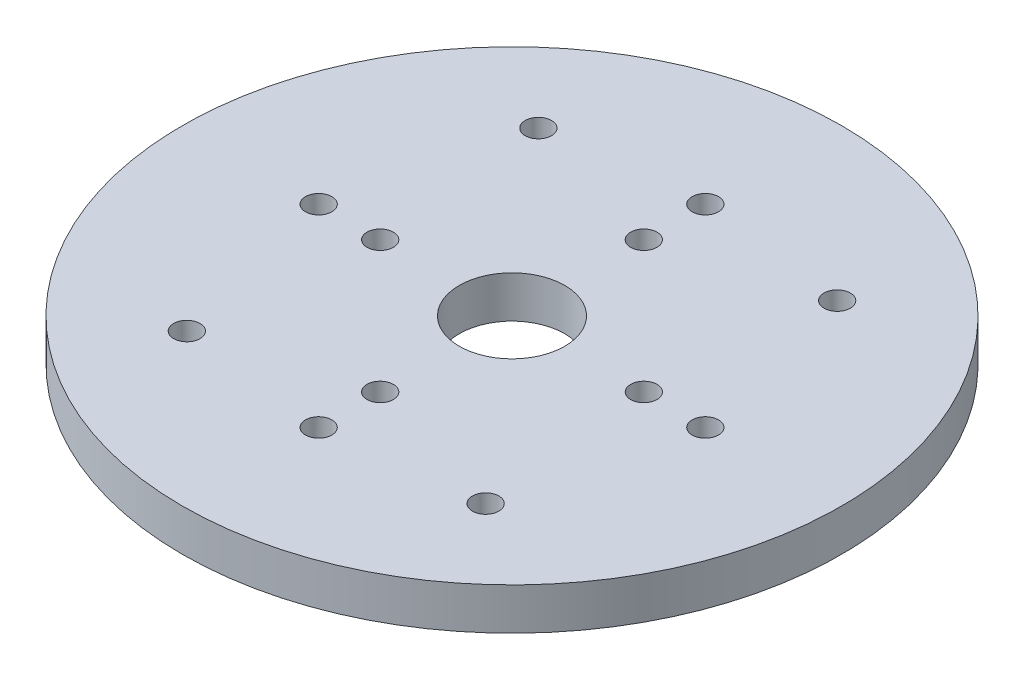
ISO-10303-21;
HEADER;
FILE_DESCRIPTION(('STEP AP214'),'2;1');
FILE_NAME('part.step','',(''),(''),'','','');
FILE_SCHEMA(('AUTOMOTIVE_DESIGN { 1 0 10303 214 1 1 1 1 }'));
ENDSEC;
DATA;
#1=APPLICATION_CONTEXT('core data for automotive mechanical design processes');
#2=APPLICATION_PROTOCOL_DEFINITION('international standard','automotive_design',2000,#1);
#3=PRODUCT_CONTEXT('',#1,'mechanical');
#4=PRODUCT('Part','Part','',(#3));
#5=PRODUCT_RELATED_PRODUCT_CATEGORY('part','',(#4));
#6=PRODUCT_DEFINITION_FORMATION('','',#4);
#7=PRODUCT_DEFINITION_CONTEXT('part definition',#1,'design');
#8=PRODUCT_DEFINITION('design','',#6,#7);
#9=PRODUCT_DEFINITION_SHAPE('','',#8);
#10=(LENGTH_UNIT() NAMED_UNIT(*) SI_UNIT(.MILLI.,.METRE.));
#11=(NAMED_UNIT(*) PLANE_ANGLE_UNIT() SI_UNIT($,.RADIAN.));
#12=(NAMED_UNIT(*) SI_UNIT($,.STERADIAN.) SOLID_ANGLE_UNIT());
#13=UNCERTAINTY_MEASURE_WITH_UNIT(LENGTH_MEASURE(1.E-05),#10,'distance_accuracy_value','');
#14=(GEOMETRIC_REPRESENTATION_CONTEXT(3) GLOBAL_UNCERTAINTY_ASSIGNED_CONTEXT((#13)) GLOBAL_UNIT_ASSIGNED_CONTEXT((#10,
#11,#12)) REPRESENTATION_CONTEXT('',''));
#15=CARTESIAN_POINT('',(0.,0.,0.));
#16=DIRECTION('',(0.,0.,1.));
#17=DIRECTION('',(1.,0.,0.));
#18=AXIS2_PLACEMENT_3D('',#15,#16,#17);
#19=CARTESIAN_POINT('',(0.,4.7625,0.));
#20=DIRECTION('',(0.,1.,0.));
#21=DIRECTION('',(0.,0.,1.));
#22=AXIS2_PLACEMENT_3D('',#19,#20,#21);
#23=PLANE('',#22);
#24=CARTESIAN_POINT('',(-17.,4.7625,-20.));
#25=DIRECTION('',(0.,1.,0.));
#26=DIRECTION('',(0.,0.,1.));
#27=AXIS2_PLACEMENT_3D('',#24,#25,#26);
#28=CIRCLE('',#27,1.49999999999999);
#29=CARTESIAN_POINT('',(-17.,4.7625,-18.5));
#30=VERTEX_POINT('',#29);
#31=EDGE_CURVE('E118',#30,#30,#28,.T.);
#32=ORIENTED_EDGE('',*,*,#31,.F.);
#33=EDGE_LOOP('',(#32));
#34=FACE_BOUND('',#33,.T.);
#35=CARTESIAN_POINT('',(17.,4.7625,20.));
#36=DIRECTION('',(0.,1.,0.));
#37=DIRECTION('',(0.,0.,1.));
#38=AXIS2_PLACEMENT_3D('',#35,#36,#37);
#39=CIRCLE('',#38,1.49999999999999);
#40=CARTESIAN_POINT('',(17.,4.7625,21.5));
#41=VERTEX_POINT('',#40);
#42=EDGE_CURVE('E112',#41,#41,#39,.T.);
#43=ORIENTED_EDGE('',*,*,#42,.F.);
#44=EDGE_LOOP('',(#43));
#45=FACE_BOUND('',#44,.T.);
#46=CARTESIAN_POINT('',(-17.,4.7625,20.));
#47=DIRECTION('',(0.,1.,0.));
#48=DIRECTION('',(0.,0.,1.));
#49=AXIS2_PLACEMENT_3D('',#46,#47,#48);
#50=CIRCLE('',#49,1.49999999999999);
#51=CARTESIAN_POINT('',(-17.,4.7625,21.5));
#52=VERTEX_POINT('',#51);
#53=EDGE_CURVE('E106',#52,#52,#50,.T.);
#54=ORIENTED_EDGE('',*,*,#53,.F.);
#55=EDGE_LOOP('',(#54));
#56=FACE_BOUND('',#55,.T.);
#57=CARTESIAN_POINT('',(17.,4.7625,-20.));
#58=DIRECTION('',(0.,1.,0.));
#59=DIRECTION('',(0.,0.,1.));
#60=AXIS2_PLACEMENT_3D('',#57,#58,#59);
#61=CIRCLE('',#60,1.49999999999999);
#62=CARTESIAN_POINT('',(17.,4.7625,-18.5));
#63=VERTEX_POINT('',#62);
#64=EDGE_CURVE('E100',#63,#63,#61,.T.);
#65=ORIENTED_EDGE('',*,*,#64,.F.);
#66=EDGE_LOOP('',(#65));
#67=FACE_BOUND('',#66,.T.);
#68=CARTESIAN_POINT('',(0.,4.7625,-15.));
#69=DIRECTION('',(0.,-1.,0.));
#70=DIRECTION('',(0.,0.,-1.));
#71=AXIS2_PLACEMENT_3D('',#68,#69,#70);
#72=CIRCLE('',#71,1.5);
#73=CARTESIAN_POINT('',(0.,4.7625,-16.5));
#74=VERTEX_POINT('',#73);
#75=EDGE_CURVE('E91',#74,#74,#72,.T.);
#76=ORIENTED_EDGE('',*,*,#75,.T.);
#77=EDGE_LOOP('',(#76));
#78=FACE_BOUND('',#77,.T.);
#79=CARTESIAN_POINT('',(0.,4.7625,-22.));
#80=DIRECTION('',(0.,-1.,0.));
#81=DIRECTION('',(0.,0.,-1.));
#82=AXIS2_PLACEMENT_3D('',#79,#80,#81);
#83=CIRCLE('',#82,1.5);
#84=CARTESIAN_POINT('',(0.,4.7625,-23.5));
#85=VERTEX_POINT('',#84);
#86=EDGE_CURVE('E85',#85,#85,#83,.T.);
#87=ORIENTED_EDGE('',*,*,#86,.T.);
#88=EDGE_LOOP('',(#87));
#89=FACE_BOUND('',#88,.T.);
#90=CARTESIAN_POINT('',(-22.,4.7625,0.));
#91=DIRECTION('',(0.,-1.,0.));
#92=DIRECTION('',(0.,0.,-1.));
#93=AXIS2_PLACEMENT_3D('',#90,#91,#92);
#94=CIRCLE('',#93,1.5);
#95=CARTESIAN_POINT('',(-22.,4.7625,-1.5));
#96=VERTEX_POINT('',#95);
#97=EDGE_CURVE('E79',#96,#96,#94,.T.);
#98=ORIENTED_EDGE('',*,*,#97,.T.);
#99=EDGE_LOOP('',(#98));
#100=FACE_BOUND('',#99,.T.);
#101=CARTESIAN_POINT('',(-15.,4.7625,0.));
#102=DIRECTION('',(0.,-1.,0.));
#103=DIRECTION('',(0.,0.,-1.));
#104=AXIS2_PLACEMENT_3D('',#101,#102,#103);
#105=CIRCLE('',#104,1.5);
#106=CARTESIAN_POINT('',(-15.,4.7625,-1.5));
#107=VERTEX_POINT('',#106);
#108=EDGE_CURVE('E73',#107,#107,#105,.T.);
#109=ORIENTED_EDGE('',*,*,#108,.T.);
#110=EDGE_LOOP('',(#109));
#111=FACE_BOUND('',#110,.T.);
#112=CARTESIAN_POINT('',(0.,4.7625,15.));
#113=DIRECTION('',(0.,-1.,0.));
#114=DIRECTION('',(0.,0.,-1.));
#115=AXIS2_PLACEMENT_3D('',#112,#113,#114);
#116=CIRCLE('',#115,1.5);
#117=CARTESIAN_POINT('',(0.,4.7625,13.5));
#118=VERTEX_POINT('',#117);
#119=EDGE_CURVE('E67',#118,#118,#116,.T.);
#120=ORIENTED_EDGE('',*,*,#119,.T.);
#121=EDGE_LOOP('',(#120));
#122=FACE_BOUND('',#121,.T.);
#123=CARTESIAN_POINT('',(0.,4.7625,22.));
#124=DIRECTION('',(0.,-1.,0.));
#125=DIRECTION('',(0.,0.,-1.));
#126=AXIS2_PLACEMENT_3D('',#123,#124,#125);
#127=CIRCLE('',#126,1.5);
#128=CARTESIAN_POINT('',(0.,4.7625,20.5));
#129=VERTEX_POINT('',#128);
#130=EDGE_CURVE('E61',#129,#129,#127,.T.);
#131=ORIENTED_EDGE('',*,*,#130,.T.);
#132=EDGE_LOOP('',(#131));
#133=FACE_BOUND('',#132,.T.);
#134=CARTESIAN_POINT('',(15.,4.7625,0.));
#135=DIRECTION('',(0.,-1.,0.));
#136=DIRECTION('',(0.,0.,-1.));
#137=AXIS2_PLACEMENT_3D('',#134,#135,#136);
#138=CIRCLE('',#137,1.5);
#139=CARTESIAN_POINT('',(15.,4.7625,-1.5));
#140=VERTEX_POINT('',#139);
#141=EDGE_CURVE('E55',#140,#140,#138,.T.);
#142=ORIENTED_EDGE('',*,*,#141,.T.);
#143=EDGE_LOOP('',(#142));
#144=FACE_BOUND('',#143,.T.);
#145=CARTESIAN_POINT('',(22.,4.7625,0.));
#146=DIRECTION('',(0.,-1.,0.));
#147=DIRECTION('',(0.,0.,-1.));
#148=AXIS2_PLACEMENT_3D('',#145,#146,#147);
#149=CIRCLE('',#148,1.5);
#150=CARTESIAN_POINT('',(22.,4.7625,-1.5));
#151=VERTEX_POINT('',#150);
#152=EDGE_CURVE('E47',#151,#151,#149,.T.);
#153=ORIENTED_EDGE('',*,*,#152,.T.);
#154=EDGE_LOOP('',(#153));
#155=FACE_BOUND('',#154,.T.);
#156=CARTESIAN_POINT('',(0.,4.7625,0.));
#157=DIRECTION('',(0.,1.,0.));
#158=DIRECTION('',(0.,0.,1.));
#159=AXIS2_PLACEMENT_3D('',#156,#157,#158);
#160=CIRCLE('',#159,37.5);
#161=CARTESIAN_POINT('',(0.,4.7625,-37.5));
#162=VERTEX_POINT('',#161);
#163=EDGE_CURVE('E10',#162,#162,#160,.T.);
#164=ORIENTED_EDGE('',*,*,#163,.T.);
#165=EDGE_LOOP('',(#164));
#166=FACE_BOUND('',#165,.T.);
#167=CARTESIAN_POINT('',(0.,4.7625,0.));
#168=DIRECTION('',(0.,1.,0.));
#169=DIRECTION('',(0.,0.,1.));
#170=AXIS2_PLACEMENT_3D('',#167,#168,#169);
#171=CIRCLE('',#170,6.);
#172=CARTESIAN_POINT('',(0.,4.7625,-6.));
#173=VERTEX_POINT('',#172);
#174=EDGE_CURVE('E42',#173,#173,#171,.T.);
#175=ORIENTED_EDGE('',*,*,#174,.F.);
#176=EDGE_LOOP('',(#175));
#177=FACE_BOUND('',#176,.T.);
#178=ADVANCED_FACE('F31',(#34,#45,#56,#67,#78,#89,#100,#111,#122,#133,#144,#155,#166,#177),#23,.T.);
#179=CARTESIAN_POINT('',(0.,0.,0.));
#180=DIRECTION('',(0.,1.,0.));
#181=DIRECTION('',(0.,0.,1.));
#182=AXIS2_PLACEMENT_3D('',#179,#180,#181);
#183=PLANE('',#182);
#184=CARTESIAN_POINT('',(-17.,0.,-20.));
#185=DIRECTION('',(0.,1.,0.));
#186=DIRECTION('',(0.,0.,1.));
#187=AXIS2_PLACEMENT_3D('',#184,#185,#186);
#188=CIRCLE('',#187,1.49999999999999);
#189=CARTESIAN_POINT('',(-17.,0.,-18.5));
#190=VERTEX_POINT('',#189);
#191=EDGE_CURVE('E115',#190,#190,#188,.T.);
#192=ORIENTED_EDGE('',*,*,#191,.T.);
#193=EDGE_LOOP('',(#192));
#194=FACE_BOUND('',#193,.T.);
#195=CARTESIAN_POINT('',(17.,0.,20.));
#196=DIRECTION('',(0.,1.,0.));
#197=DIRECTION('',(0.,0.,1.));
#198=AXIS2_PLACEMENT_3D('',#195,#196,#197);
#199=CIRCLE('',#198,1.49999999999999);
#200=CARTESIAN_POINT('',(17.,0.,21.5));
#201=VERTEX_POINT('',#200);
#202=EDGE_CURVE('E109',#201,#201,#199,.T.);
#203=ORIENTED_EDGE('',*,*,#202,.T.);
#204=EDGE_LOOP('',(#203));
#205=FACE_BOUND('',#204,.T.);
#206=CARTESIAN_POINT('',(-17.,0.,20.));
#207=DIRECTION('',(0.,1.,0.));
#208=DIRECTION('',(0.,0.,1.));
#209=AXIS2_PLACEMENT_3D('',#206,#207,#208);
#210=CIRCLE('',#209,1.49999999999999);
#211=CARTESIAN_POINT('',(-17.,0.,21.5));
#212=VERTEX_POINT('',#211);
#213=EDGE_CURVE('E103',#212,#212,#210,.T.);
#214=ORIENTED_EDGE('',*,*,#213,.T.);
#215=EDGE_LOOP('',(#214));
#216=FACE_BOUND('',#215,.T.);
#217=CARTESIAN_POINT('',(17.,0.,-20.));
#218=DIRECTION('',(0.,1.,0.));
#219=DIRECTION('',(0.,0.,1.));
#220=AXIS2_PLACEMENT_3D('',#217,#218,#219);
#221=CIRCLE('',#220,1.49999999999999);
#222=CARTESIAN_POINT('',(17.,0.,-18.5));
#223=VERTEX_POINT('',#222);
#224=EDGE_CURVE('E97',#223,#223,#221,.T.);
#225=ORIENTED_EDGE('',*,*,#224,.T.);
#226=EDGE_LOOP('',(#225));
#227=FACE_BOUND('',#226,.T.);
#228=CARTESIAN_POINT('',(0.,0.,-15.));
#229=DIRECTION('',(0.,-1.,0.));
#230=DIRECTION('',(0.,0.,-1.));
#231=AXIS2_PLACEMENT_3D('',#228,#229,#230);
#232=CIRCLE('',#231,1.5);
#233=CARTESIAN_POINT('',(0.,0.,-16.5));
#234=VERTEX_POINT('',#233);
#235=EDGE_CURVE('E94',#234,#234,#232,.T.);
#236=ORIENTED_EDGE('',*,*,#235,.F.);
#237=EDGE_LOOP('',(#236));
#238=FACE_BOUND('',#237,.T.);
#239=CARTESIAN_POINT('',(0.,0.,-22.));
#240=DIRECTION('',(0.,-1.,0.));
#241=DIRECTION('',(0.,0.,-1.));
#242=AXIS2_PLACEMENT_3D('',#239,#240,#241);
#243=CIRCLE('',#242,1.5);
#244=CARTESIAN_POINT('',(0.,0.,-23.5));
#245=VERTEX_POINT('',#244);
#246=EDGE_CURVE('E88',#245,#245,#243,.T.);
#247=ORIENTED_EDGE('',*,*,#246,.F.);
#248=EDGE_LOOP('',(#247));
#249=FACE_BOUND('',#248,.T.);
#250=CARTESIAN_POINT('',(-22.,0.,0.));
#251=DIRECTION('',(0.,-1.,0.));
#252=DIRECTION('',(0.,0.,-1.));
#253=AXIS2_PLACEMENT_3D('',#250,#251,#252);
#254=CIRCLE('',#253,1.5);
#255=CARTESIAN_POINT('',(-22.,0.,-1.5));
#256=VERTEX_POINT('',#255);
#257=EDGE_CURVE('E82',#256,#256,#254,.T.);
#258=ORIENTED_EDGE('',*,*,#257,.F.);
#259=EDGE_LOOP('',(#258));
#260=FACE_BOUND('',#259,.T.);
#261=CARTESIAN_POINT('',(-15.,0.,0.));
#262=DIRECTION('',(0.,-1.,0.));
#263=DIRECTION('',(0.,0.,-1.));
#264=AXIS2_PLACEMENT_3D('',#261,#262,#263);
#265=CIRCLE('',#264,1.5);
#266=CARTESIAN_POINT('',(-15.,0.,-1.5));
#267=VERTEX_POINT('',#266);
#268=EDGE_CURVE('E76',#267,#267,#265,.T.);
#269=ORIENTED_EDGE('',*,*,#268,.F.);
#270=EDGE_LOOP('',(#269));
#271=FACE_BOUND('',#270,.T.);
#272=CARTESIAN_POINT('',(0.,0.,15.));
#273=DIRECTION('',(0.,-1.,0.));
#274=DIRECTION('',(0.,0.,-1.));
#275=AXIS2_PLACEMENT_3D('',#272,#273,#274);
#276=CIRCLE('',#275,1.5);
#277=CARTESIAN_POINT('',(0.,0.,13.5));
#278=VERTEX_POINT('',#277);
#279=EDGE_CURVE('E70',#278,#278,#276,.T.);
#280=ORIENTED_EDGE('',*,*,#279,.F.);
#281=EDGE_LOOP('',(#280));
#282=FACE_BOUND('',#281,.T.);
#283=CARTESIAN_POINT('',(0.,0.,22.));
#284=DIRECTION('',(0.,-1.,0.));
#285=DIRECTION('',(0.,0.,-1.));
#286=AXIS2_PLACEMENT_3D('',#283,#284,#285);
#287=CIRCLE('',#286,1.5);
#288=CARTESIAN_POINT('',(0.,0.,20.5));
#289=VERTEX_POINT('',#288);
#290=EDGE_CURVE('E64',#289,#289,#287,.T.);
#291=ORIENTED_EDGE('',*,*,#290,.F.);
#292=EDGE_LOOP('',(#291));
#293=FACE_BOUND('',#292,.T.);
#294=CARTESIAN_POINT('',(15.,0.,0.));
#295=DIRECTION('',(0.,-1.,0.));
#296=DIRECTION('',(0.,0.,-1.));
#297=AXIS2_PLACEMENT_3D('',#294,#295,#296);
#298=CIRCLE('',#297,1.5);
#299=CARTESIAN_POINT('',(15.,0.,-1.5));
#300=VERTEX_POINT('',#299);
#301=EDGE_CURVE('E58',#300,#300,#298,.T.);
#302=ORIENTED_EDGE('',*,*,#301,.F.);
#303=EDGE_LOOP('',(#302));
#304=FACE_BOUND('',#303,.T.);
#305=CARTESIAN_POINT('',(22.,0.,0.));
#306=DIRECTION('',(0.,-1.,0.));
#307=DIRECTION('',(0.,0.,-1.));
#308=AXIS2_PLACEMENT_3D('',#305,#306,#307);
#309=CIRCLE('',#308,1.5);
#310=CARTESIAN_POINT('',(22.,0.,-1.5));
#311=VERTEX_POINT('',#310);
#312=EDGE_CURVE('E52',#311,#311,#309,.T.);
#313=ORIENTED_EDGE('',*,*,#312,.F.);
#314=EDGE_LOOP('',(#313));
#315=FACE_BOUND('',#314,.T.);
#316=CARTESIAN_POINT('',(0.,0.,0.));
#317=DIRECTION('',(0.,1.,0.));
#318=DIRECTION('',(0.,0.,1.));
#319=AXIS2_PLACEMENT_3D('',#316,#317,#318);
#320=CIRCLE('',#319,37.5);
#321=CARTESIAN_POINT('',(0.,0.,-37.5));
#322=VERTEX_POINT('',#321);
#323=EDGE_CURVE('E35',#322,#322,#320,.T.);
#324=ORIENTED_EDGE('',*,*,#323,.F.);
#325=EDGE_LOOP('',(#324));
#326=FACE_BOUND('',#325,.T.);
#327=CARTESIAN_POINT('',(0.,0.,0.));
#328=DIRECTION('',(0.,1.,0.));
#329=DIRECTION('',(0.,0.,1.));
#330=AXIS2_PLACEMENT_3D('',#327,#328,#329);
#331=CIRCLE('',#330,6.);
#332=CARTESIAN_POINT('',(0.,0.,-6.));
#333=VERTEX_POINT('',#332);
#334=EDGE_CURVE('E44',#333,#333,#331,.T.);
#335=ORIENTED_EDGE('',*,*,#334,.T.);
#336=EDGE_LOOP('',(#335));
#337=FACE_BOUND('',#336,.T.);
#338=ADVANCED_FACE('F127',(#194,#205,#216,#227,#238,#249,#260,#271,#282,#293,#304,#315,#326,
#337),#183,.F.);
#339=CARTESIAN_POINT('',(0.,4.7625,0.));
#340=DIRECTION('',(0.,-1.,0.));
#341=DIRECTION('',(0.,0.,-1.));
#342=AXIS2_PLACEMENT_3D('',#339,#340,#341);
#343=CYLINDRICAL_SURFACE('',#342,37.5);
#344=CARTESIAN_POINT('',(0.,4.7625,-37.5));
#345=CARTESIAN_POINT('',(0.,4.712890625,-37.5));
#346=CARTESIAN_POINT('',(0.,4.66328125,-37.5));
#347=CARTESIAN_POINT('',(0.,4.5640625,-37.5));
#348=CARTESIAN_POINT('',(0.,4.514453125,-37.5));
#349=CARTESIAN_POINT('',(0.,4.415234375,-37.5));
#350=CARTESIAN_POINT('',(0.,4.365625,-37.5));
#351=CARTESIAN_POINT('',(0.,4.26640625,-37.5));
#352=CARTESIAN_POINT('',(0.,4.216796875,-37.5));
#353=CARTESIAN_POINT('',(0.,4.117578125,-37.5));
#354=CARTESIAN_POINT('',(0.,4.06796875,-37.5));
#355=CARTESIAN_POINT('',(0.,3.96875,-37.5));
#356=CARTESIAN_POINT('',(0.,3.919140625,-37.5));
#357=CARTESIAN_POINT('',(0.,3.819921875,-37.5));
#358=CARTESIAN_POINT('',(0.,3.7703125,-37.5));
#359=CARTESIAN_POINT('',(0.,3.67109375,-37.5));
#360=CARTESIAN_POINT('',(0.,3.621484375,-37.5));
#361=CARTESIAN_POINT('',(0.,3.522265625,-37.5));
#362=CARTESIAN_POINT('',(0.,3.47265625,-37.5));
#363=CARTESIAN_POINT('',(0.,3.3734375,-37.5));
#364=CARTESIAN_POINT('',(0.,3.323828125,-37.5));
#365=CARTESIAN_POINT('',(0.,3.224609375,-37.5));
#366=CARTESIAN_POINT('',(0.,3.175,-37.5));
#367=CARTESIAN_POINT('',(0.,3.07578125,-37.5));
#368=CARTESIAN_POINT('',(0.,3.026171875,-37.5));
#369=CARTESIAN_POINT('',(0.,2.926953125,-37.5));
#370=CARTESIAN_POINT('',(0.,2.87734375,-37.5));
#371=CARTESIAN_POINT('',(0.,2.778125,-37.5));
#372=CARTESIAN_POINT('',(0.,2.728515625,-37.5));
#373=CARTESIAN_POINT('',(0.,2.629296875,-37.5));
#374=CARTESIAN_POINT('',(0.,2.5796875,-37.5));
#375=CARTESIAN_POINT('',(0.,2.48046875,-37.5));
#376=CARTESIAN_POINT('',(0.,2.430859375,-37.5));
#377=CARTESIAN_POINT('',(0.,2.331640625,-37.5));
#378=CARTESIAN_POINT('',(0.,2.28203125,-37.5));
#379=CARTESIAN_POINT('',(0.,2.1828125,-37.5));
#380=CARTESIAN_POINT('',(0.,2.133203125,-37.5));
#381=CARTESIAN_POINT('',(0.,2.033984375,-37.5));
#382=CARTESIAN_POINT('',(0.,1.984375,-37.5));
#383=CARTESIAN_POINT('',(0.,1.88515625,-37.5));
#384=CARTESIAN_POINT('',(0.,1.835546875,-37.5));
#385=CARTESIAN_POINT('',(0.,1.736328125,-37.5));
#386=CARTESIAN_POINT('',(0.,1.68671875,-37.5));
#387=CARTESIAN_POINT('',(0.,1.5875,-37.5));
#388=CARTESIAN_POINT('',(0.,1.537890625,-37.5));
#389=CARTESIAN_POINT('',(0.,1.438671875,-37.5));
#390=CARTESIAN_POINT('',(0.,1.3890625,-37.5));
#391=CARTESIAN_POINT('',(0.,1.28984375,-37.5));
#392=CARTESIAN_POINT('',(0.,1.240234375,-37.5));
#393=CARTESIAN_POINT('',(0.,1.141015625,-37.5));
#394=CARTESIAN_POINT('',(0.,1.09140625,-37.5));
#395=CARTESIAN_POINT('',(0.,0.9921875,-37.5));
#396=CARTESIAN_POINT('',(0.,0.942578125,-37.5));
#397=CARTESIAN_POINT('',(0.,0.843359375,-37.5));
#398=CARTESIAN_POINT('',(0.,0.79375,-37.5));
#399=CARTESIAN_POINT('',(0.,0.69453125,-37.5));
#400=CARTESIAN_POINT('',(0.,0.644921875,-37.5));
#401=CARTESIAN_POINT('',(0.,0.545703125,-37.5));
#402=CARTESIAN_POINT('',(0.,0.49609375,-37.5));
#403=CARTESIAN_POINT('',(0.,0.396875,-37.5));
#404=CARTESIAN_POINT('',(0.,0.347265625,-37.5));
#405=CARTESIAN_POINT('',(0.,0.248046875,-37.5));
#406=CARTESIAN_POINT('',(0.,0.1984375,-37.5));
#407=CARTESIAN_POINT('',(0.,0.09921875,-37.5));
#408=CARTESIAN_POINT('',(0.,0.049609375,-37.5));
#409=CARTESIAN_POINT('',(0.,0.,-37.5));
#410=B_SPLINE_CURVE_WITH_KNOTS('',3,(#344,#345,#346,#347,#348,#349,#350,#351,#352,#353,#354,
#355,#356,#357,#358,#359,#360,#361,#362,#363,#364,#365,#366,#367,#368,#369,#370,#371,#372,#373,
#374,#375,#376,#377,#378,#379,#380,#381,#382,#383,#384,#385,#386,#387,#388,#389,#390,#391,#392,
#393,#394,#395,#396,#397,#398,#399,#400,#401,#402,#403,#404,#405,#406,#407,#408,#409),
.UNSPECIFIED.,.F.,.F.,(4,2,2,2,2,2,2,2,2,2,2,2,2,2,2,2,2,2,2,2,2,2,2,2,2,2,2,2,2,2,2,2,4),(0.,
0.148828124999999,0.297656249999999,0.446484374999999,0.595312499999999,0.744140625,0.89296875,
1.041796875,1.190625,1.339453125,1.48828125,1.637109375,1.7859375,1.934765625,2.08359375,
2.232421875,2.38125,2.530078125,2.67890625,2.827734375,2.9765625,3.125390625,3.27421875,
3.423046875,3.571875,3.720703125,3.86953125,4.018359375,4.1671875,4.316015625,4.46484375,
4.613671875,4.7625),.UNSPECIFIED.);
#411=EDGE_CURVE('BSEAM33',#162,#322,#410,.T.);
#412=ORIENTED_EDGE('',*,*,#163,.F.);
#413=ORIENTED_EDGE('',*,*,#323,.T.);
#414=ORIENTED_EDGE('',*,*,#411,.T.);
#415=ORIENTED_EDGE('',*,*,#411,.F.);
#416=EDGE_LOOP('',(#412,#414,#413,#415));
#417=FACE_BOUND('',#416,.T.);
#418=ADVANCED_FACE('F33',(#417),#343,.T.);
#419=CARTESIAN_POINT('',(0.,4.7625,0.));
#420=DIRECTION('',(0.,-1.,0.));
#421=DIRECTION('',(0.,0.,-1.));
#422=AXIS2_PLACEMENT_3D('',#419,#420,#421);
#423=CYLINDRICAL_SURFACE('',#422,6.);
#424=CARTESIAN_POINT('',(0.,4.7625,-6.));
#425=CARTESIAN_POINT('',(0.,4.712890625,-6.));
#426=CARTESIAN_POINT('',(0.,4.66328125,-6.));
#427=CARTESIAN_POINT('',(0.,4.5640625,-6.));
#428=CARTESIAN_POINT('',(0.,4.514453125,-6.));
#429=CARTESIAN_POINT('',(0.,4.415234375,-6.));
#430=CARTESIAN_POINT('',(0.,4.365625,-6.));
#431=CARTESIAN_POINT('',(0.,4.26640625,-6.));
#432=CARTESIAN_POINT('',(0.,4.216796875,-6.));
#433=CARTESIAN_POINT('',(0.,4.117578125,-6.));
#434=CARTESIAN_POINT('',(0.,4.06796875,-6.));
#435=CARTESIAN_POINT('',(0.,3.96875,-6.));
#436=CARTESIAN_POINT('',(0.,3.919140625,-6.));
#437=CARTESIAN_POINT('',(0.,3.819921875,-6.));
#438=CARTESIAN_POINT('',(0.,3.7703125,-6.));
#439=CARTESIAN_POINT('',(0.,3.67109375,-6.));
#440=CARTESIAN_POINT('',(0.,3.621484375,-6.));
#441=CARTESIAN_POINT('',(0.,3.522265625,-6.));
#442=CARTESIAN_POINT('',(0.,3.47265625,-6.));
#443=CARTESIAN_POINT('',(0.,3.3734375,-6.));
#444=CARTESIAN_POINT('',(0.,3.323828125,-6.));
#445=CARTESIAN_POINT('',(0.,3.224609375,-6.));
#446=CARTESIAN_POINT('',(0.,3.175,-6.));
#447=CARTESIAN_POINT('',(0.,3.07578125,-6.));
#448=CARTESIAN_POINT('',(0.,3.026171875,-6.));
#449=CARTESIAN_POINT('',(0.,2.926953125,-6.));
#450=CARTESIAN_POINT('',(0.,2.87734375,-6.));
#451=CARTESIAN_POINT('',(0.,2.778125,-6.));
#452=CARTESIAN_POINT('',(0.,2.728515625,-6.));
#453=CARTESIAN_POINT('',(0.,2.629296875,-6.));
#454=CARTESIAN_POINT('',(0.,2.5796875,-6.));
#455=CARTESIAN_POINT('',(0.,2.48046875,-6.));
#456=CARTESIAN_POINT('',(0.,2.430859375,-6.));
#457=CARTESIAN_POINT('',(0.,2.331640625,-6.));
#458=CARTESIAN_POINT('',(0.,2.28203125,-6.));
#459=CARTESIAN_POINT('',(0.,2.1828125,-6.));
#460=CARTESIAN_POINT('',(0.,2.133203125,-6.));
#461=CARTESIAN_POINT('',(0.,2.033984375,-6.));
#462=CARTESIAN_POINT('',(0.,1.984375,-6.));
#463=CARTESIAN_POINT('',(0.,1.88515625,-6.));
#464=CARTESIAN_POINT('',(0.,1.835546875,-6.));
#465=CARTESIAN_POINT('',(0.,1.736328125,-6.));
#466=CARTESIAN_POINT('',(0.,1.68671875,-6.));
#467=CARTESIAN_POINT('',(0.,1.5875,-6.));
#468=CARTESIAN_POINT('',(0.,1.537890625,-6.));
#469=CARTESIAN_POINT('',(0.,1.438671875,-6.));
#470=CARTESIAN_POINT('',(0.,1.3890625,-6.));
#471=CARTESIAN_POINT('',(0.,1.28984375,-6.));
#472=CARTESIAN_POINT('',(0.,1.240234375,-6.));
#473=CARTESIAN_POINT('',(0.,1.141015625,-6.));
#474=CARTESIAN_POINT('',(0.,1.09140625,-6.));
#475=CARTESIAN_POINT('',(0.,0.992187499999999,-6.));
#476=CARTESIAN_POINT('',(0.,0.942578124999999,-6.));
#477=CARTESIAN_POINT('',(0.,0.843359375,-6.));
#478=CARTESIAN_POINT('',(0.,0.79375,-6.));
#479=CARTESIAN_POINT('',(0.,0.69453125,-6.));
#480=CARTESIAN_POINT('',(0.,0.644921875,-6.));
#481=CARTESIAN_POINT('',(0.,0.545703125,-6.));
#482=CARTESIAN_POINT('',(0.,0.49609375,-6.));
#483=CARTESIAN_POINT('',(0.,0.396875,-6.));
#484=CARTESIAN_POINT('',(0.,0.347265625,-6.));
#485=CARTESIAN_POINT('',(0.,0.248046875,-6.));
#486=CARTESIAN_POINT('',(0.,0.1984375,-6.));
#487=CARTESIAN_POINT('',(0.,0.09921875,-6.));
#488=CARTESIAN_POINT('',(0.,0.049609375,-6.));
#489=CARTESIAN_POINT('',(0.,0.,-6.));
#490=B_SPLINE_CURVE_WITH_KNOTS('',3,(#424,#425,#426,#427,#428,#429,#430,#431,#432,#433,#434,
#435,#436,#437,#438,#439,#440,#441,#442,#443,#444,#445,#446,#447,#448,#449,#450,#451,#452,#453,
#454,#455,#456,#457,#458,#459,#460,#461,#462,#463,#464,#465,#466,#467,#468,#469,#470,#471,#472,
#473,#474,#475,#476,#477,#478,#479,#480,#481,#482,#483,#484,#485,#486,#487,#488,#489),
.UNSPECIFIED.,.F.,.F.,(4,2,2,2,2,2,2,2,2,2,2,2,2,2,2,2,2,2,2,2,2,2,2,2,2,2,2,2,2,2,2,2,4),(0.,
0.148828125,0.29765625,0.446484375,0.5953125,0.744140625,0.892968750000001,1.041796875,1.190625,
1.339453125,1.48828125,1.637109375,1.7859375,1.934765625,2.08359375,2.232421875,2.38125,
2.530078125,2.67890625,2.827734375,2.9765625,3.125390625,3.27421875,3.423046875,3.571875,
3.720703125,3.86953125,4.018359375,4.1671875,4.316015625,4.46484375,4.613671875,4.7625),.UNSPECIFIED.);
#491=EDGE_CURVE('BSEAM153',#173,#333,#490,.T.);
#492=ORIENTED_EDGE('',*,*,#174,.T.);
#493=ORIENTED_EDGE('',*,*,#334,.F.);
#494=ORIENTED_EDGE('',*,*,#491,.T.);
#495=ORIENTED_EDGE('',*,*,#491,.F.);
#496=EDGE_LOOP('',(#492,#494,#493,#495));
#497=FACE_BOUND('',#496,.T.);
#498=ADVANCED_FACE('F153',(#497),#423,.F.);
#499=CARTESIAN_POINT('',(22.,0.,0.));
#500=DIRECTION('',(0.,-1.,0.));
#501=DIRECTION('',(0.,0.,-1.));
#502=AXIS2_PLACEMENT_3D('',#499,#500,#501);
#503=CYLINDRICAL_SURFACE('',#502,1.5);
#504=ORIENTED_EDGE('',*,*,#152,.F.);
#505=EDGE_LOOP('',(#504));
#506=FACE_BOUND('',#505,.T.);
#507=ORIENTED_EDGE('',*,*,#312,.T.);
#508=EDGE_LOOP('',(#507));
#509=FACE_BOUND('',#508,.T.);
#510=ADVANCED_FACE('F156',(#506,#509),#503,.F.);
#511=CARTESIAN_POINT('',(15.,0.,0.));
#512=DIRECTION('',(0.,-1.,0.));
#513=DIRECTION('',(0.,0.,-1.));
#514=AXIS2_PLACEMENT_3D('',#511,#512,#513);
#515=CYLINDRICAL_SURFACE('',#514,1.5);
#516=ORIENTED_EDGE('',*,*,#141,.F.);
#517=EDGE_LOOP('',(#516));
#518=FACE_BOUND('',#517,.T.);
#519=ORIENTED_EDGE('',*,*,#301,.T.);
#520=EDGE_LOOP('',(#519));
#521=FACE_BOUND('',#520,.T.);
#522=ADVANCED_FACE('F170',(#518,#521),#515,.F.);
#523=CARTESIAN_POINT('',(0.,0.,22.));
#524=DIRECTION('',(0.,-1.,0.));
#525=DIRECTION('',(0.,0.,-1.));
#526=AXIS2_PLACEMENT_3D('',#523,#524,#525);
#527=CYLINDRICAL_SURFACE('',#526,1.5);
#528=ORIENTED_EDGE('',*,*,#130,.F.);
#529=EDGE_LOOP('',(#528));
#530=FACE_BOUND('',#529,.T.);
#531=ORIENTED_EDGE('',*,*,#290,.T.);
#532=EDGE_LOOP('',(#531));
#533=FACE_BOUND('',#532,.T.);
#534=ADVANCED_FACE('F174',(#530,#533),#527,.F.);
#535=CARTESIAN_POINT('',(0.,0.,15.));
#536=DIRECTION('',(0.,-1.,0.));
#537=DIRECTION('',(0.,0.,-1.));
#538=AXIS2_PLACEMENT_3D('',#535,#536,#537);
#539=CYLINDRICAL_SURFACE('',#538,1.5);
#540=ORIENTED_EDGE('',*,*,#119,.F.);
#541=EDGE_LOOP('',(#540));
#542=FACE_BOUND('',#541,.T.);
#543=ORIENTED_EDGE('',*,*,#279,.T.);
#544=EDGE_LOOP('',(#543));
#545=FACE_BOUND('',#544,.T.);
#546=ADVANCED_FACE('F178',(#542,#545),#539,.F.);
#547=CARTESIAN_POINT('',(-15.,0.,0.));
#548=DIRECTION('',(0.,-1.,0.));
#549=DIRECTION('',(0.,0.,-1.));
#550=AXIS2_PLACEMENT_3D('',#547,#548,#549);
#551=CYLINDRICAL_SURFACE('',#550,1.5);
#552=ORIENTED_EDGE('',*,*,#108,.F.);
#553=EDGE_LOOP('',(#552));
#554=FACE_BOUND('',#553,.T.);
#555=ORIENTED_EDGE('',*,*,#268,.T.);
#556=EDGE_LOOP('',(#555));
#557=FACE_BOUND('',#556,.T.);
#558=ADVANCED_FACE('F182',(#554,#557),#551,.F.);
#559=CARTESIAN_POINT('',(-22.,0.,0.));
#560=DIRECTION('',(0.,-1.,0.));
#561=DIRECTION('',(0.,0.,-1.));
#562=AXIS2_PLACEMENT_3D('',#559,#560,#561);
#563=CYLINDRICAL_SURFACE('',#562,1.5);
#564=ORIENTED_EDGE('',*,*,#97,.F.);
#565=EDGE_LOOP('',(#564));
#566=FACE_BOUND('',#565,.T.);
#567=ORIENTED_EDGE('',*,*,#257,.T.);
#568=EDGE_LOOP('',(#567));
#569=FACE_BOUND('',#568,.T.);
#570=ADVANCED_FACE('F186',(#566,#569),#563,.F.);
#571=CARTESIAN_POINT('',(0.,0.,-22.));
#572=DIRECTION('',(0.,-1.,0.));
#573=DIRECTION('',(0.,0.,-1.));
#574=AXIS2_PLACEMENT_3D('',#571,#572,#573);
#575=CYLINDRICAL_SURFACE('',#574,1.5);
#576=ORIENTED_EDGE('',*,*,#86,.F.);
#577=EDGE_LOOP('',(#576));
#578=FACE_BOUND('',#577,.T.);
#579=ORIENTED_EDGE('',*,*,#246,.T.);
#580=EDGE_LOOP('',(#579));
#581=FACE_BOUND('',#580,.T.);
#582=ADVANCED_FACE('F190',(#578,#581),#575,.F.);
#583=CARTESIAN_POINT('',(0.,0.,-15.));
#584=DIRECTION('',(0.,-1.,0.));
#585=DIRECTION('',(0.,0.,-1.));
#586=AXIS2_PLACEMENT_3D('',#583,#584,#585);
#587=CYLINDRICAL_SURFACE('',#586,1.5);
#588=ORIENTED_EDGE('',*,*,#75,.F.);
#589=EDGE_LOOP('',(#588));
#590=FACE_BOUND('',#589,.T.);
#591=ORIENTED_EDGE('',*,*,#235,.T.);
#592=EDGE_LOOP('',(#591));
#593=FACE_BOUND('',#592,.T.);
#594=ADVANCED_FACE('F194',(#590,#593),#587,.F.);
#595=CARTESIAN_POINT('',(17.,4.7625,-20.));
#596=DIRECTION('',(0.,1.,0.));
#597=DIRECTION('',(0.,0.,1.));
#598=AXIS2_PLACEMENT_3D('',#595,#596,#597);
#599=CYLINDRICAL_SURFACE('',#598,1.49999999999999);
#600=ORIENTED_EDGE('',*,*,#64,.T.);
#601=EDGE_LOOP('',(#600));
#602=FACE_BOUND('',#601,.T.);
#603=ORIENTED_EDGE('',*,*,#224,.F.);
#604=EDGE_LOOP('',(#603));
#605=FACE_BOUND('',#604,.T.);
#606=ADVANCED_FACE('F198',(#602,#605),#599,.F.);
#607=CARTESIAN_POINT('',(-17.,4.7625,20.));
#608=DIRECTION('',(0.,1.,0.));
#609=DIRECTION('',(0.,0.,1.));
#610=AXIS2_PLACEMENT_3D('',#607,#608,#609);
#611=CYLINDRICAL_SURFACE('',#610,1.49999999999999);
#612=ORIENTED_EDGE('',*,*,#53,.T.);
#613=EDGE_LOOP('',(#612));
#614=FACE_BOUND('',#613,.T.);
#615=ORIENTED_EDGE('',*,*,#213,.F.);
#616=EDGE_LOOP('',(#615));
#617=FACE_BOUND('',#616,.T.);
#618=ADVANCED_FACE('F202',(#614,#617),#611,.F.);
#619=CARTESIAN_POINT('',(17.,4.7625,20.));
#620=DIRECTION('',(0.,1.,0.));
#621=DIRECTION('',(0.,0.,1.));
#622=AXIS2_PLACEMENT_3D('',#619,#620,#621);
#623=CYLINDRICAL_SURFACE('',#622,1.49999999999999);
#624=ORIENTED_EDGE('',*,*,#42,.T.);
#625=EDGE_LOOP('',(#624));
#626=FACE_BOUND('',#625,.T.);
#627=ORIENTED_EDGE('',*,*,#202,.F.);
#628=EDGE_LOOP('',(#627));
#629=FACE_BOUND('',#628,.T.);
#630=ADVANCED_FACE('F206',(#626,#629),#623,.F.);
#631=CARTESIAN_POINT('',(-17.,4.7625,-20.));
#632=DIRECTION('',(0.,1.,0.));
#633=DIRECTION('',(0.,0.,1.));
#634=AXIS2_PLACEMENT_3D('',#631,#632,#633);
#635=CYLINDRICAL_SURFACE('',#634,1.49999999999999);
#636=ORIENTED_EDGE('',*,*,#31,.T.);
#637=EDGE_LOOP('',(#636));
#638=FACE_BOUND('',#637,.T.);
#639=ORIENTED_EDGE('',*,*,#191,.F.);
#640=EDGE_LOOP('',(#639));
#641=FACE_BOUND('',#640,.T.);
#642=ADVANCED_FACE('F122',(#638,#641),#635,.F.);
#643=CLOSED_SHELL('',(#178,#338,#418,#498,#510,#522,#534,#546,#558,#570,#582,#594,#606,#618,
#630,#642));
#644=MANIFOLD_SOLID_BREP('B2',#643);
#645=ADVANCED_BREP_SHAPE_REPRESENTATION('',(#18,#644),#14);
#646=SHAPE_DEFINITION_REPRESENTATION(#9,#645);
ENDSEC;
END-ISO-10303-21;
